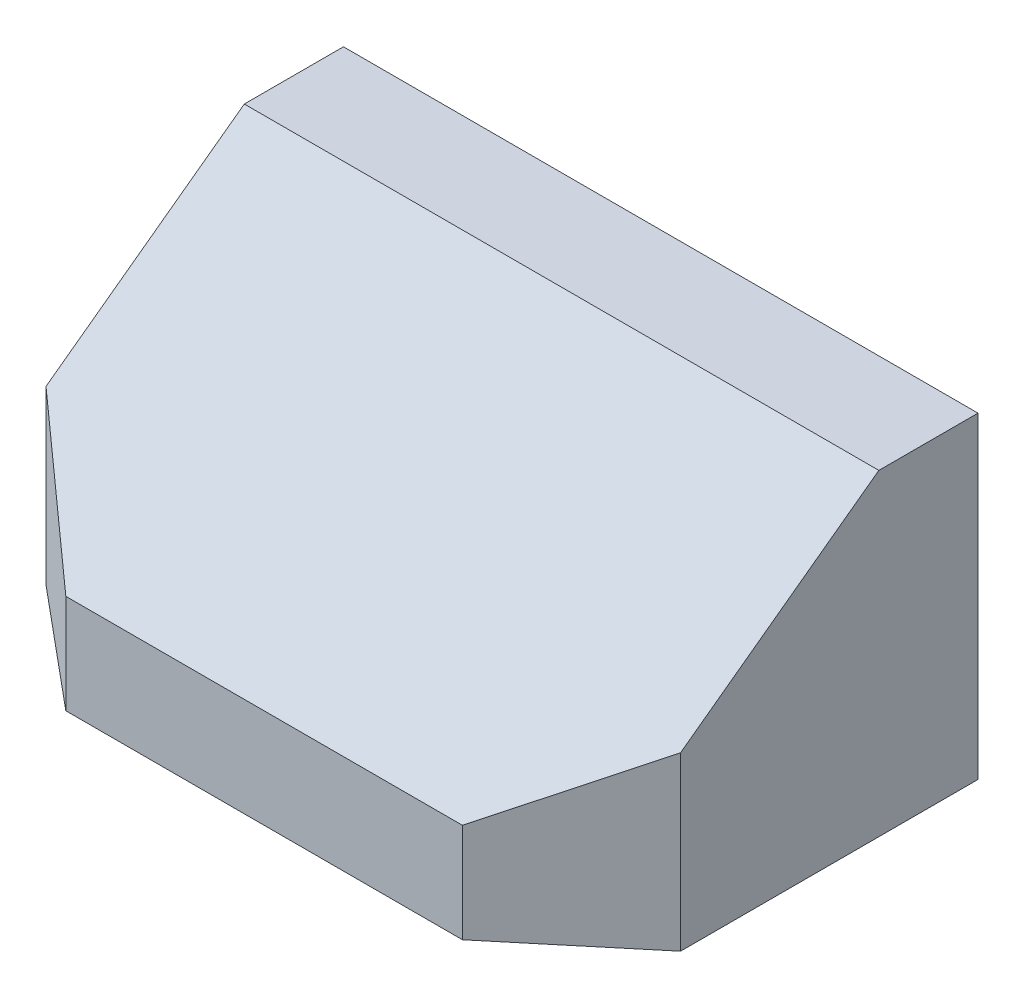
ISO-10303-21;
HEADER;
FILE_DESCRIPTION(('STEP AP214'),'2;1');
FILE_NAME('part.step','',(''),(''),'','','');
FILE_SCHEMA(('AUTOMOTIVE_DESIGN { 1 0 10303 214 1 1 1 1 }'));
ENDSEC;
DATA;
#1=APPLICATION_CONTEXT('core data for automotive mechanical design processes');
#2=APPLICATION_PROTOCOL_DEFINITION('international standard','automotive_design',2000,#1);
#3=PRODUCT_CONTEXT('',#1,'mechanical');
#4=PRODUCT('Part','Part','',(#3));
#5=PRODUCT_RELATED_PRODUCT_CATEGORY('part','',(#4));
#6=PRODUCT_DEFINITION_FORMATION('','',#4);
#7=PRODUCT_DEFINITION_CONTEXT('part definition',#1,'design');
#8=PRODUCT_DEFINITION('design','',#6,#7);
#9=PRODUCT_DEFINITION_SHAPE('','',#8);
#10=(LENGTH_UNIT() NAMED_UNIT(*) SI_UNIT(.MILLI.,.METRE.));
#11=(NAMED_UNIT(*) PLANE_ANGLE_UNIT() SI_UNIT($,.RADIAN.));
#12=(NAMED_UNIT(*) SI_UNIT($,.STERADIAN.) SOLID_ANGLE_UNIT());
#13=UNCERTAINTY_MEASURE_WITH_UNIT(LENGTH_MEASURE(1.E-05),#10,'distance_accuracy_value','');
#14=(GEOMETRIC_REPRESENTATION_CONTEXT(3) GLOBAL_UNCERTAINTY_ASSIGNED_CONTEXT((#13)) GLOBAL_UNIT_ASSIGNED_CONTEXT((#10,
#11,#12)) REPRESENTATION_CONTEXT('',''));
#15=CARTESIAN_POINT('',(0.,0.,0.));
#16=DIRECTION('',(0.,0.,1.));
#17=DIRECTION('',(1.,0.,0.));
#18=AXIS2_PLACEMENT_3D('',#15,#16,#17);
#19=CARTESIAN_POINT('',(-101.6,15.875,0.));
#20=DIRECTION('',(0.,0.,1.));
#21=DIRECTION('',(0.,-1.,0.));
#22=AXIS2_PLACEMENT_3D('',#19,#20,#21);
#23=PLANE('',#22);
#24=DIRECTION('',(0.,-1.,0.));
#25=VECTOR('',#24,1.);
#26=CARTESIAN_POINT('',(-82.55,101.6,0.));
#27=LINE('',#26,#25);
#28=CARTESIAN_POINT('',(-82.55,15.875,0.));
#29=VERTEX_POINT('',#28);
#30=CARTESIAN_POINT('',(-82.55,0.,0.));
#31=VERTEX_POINT('',#30);
#32=EDGE_CURVE('E102',#29,#31,#27,.T.);
#33=ORIENTED_EDGE('',*,*,#32,.T.);
#34=DIRECTION('',(1.,0.,0.));
#35=VECTOR('',#34,1.);
#36=CARTESIAN_POINT('',(-101.6,0.,0.));
#37=LINE('',#36,#35);
#38=CARTESIAN_POINT('',(-19.05,0.,0.));
#39=VERTEX_POINT('',#38);
#40=EDGE_CURVE('E101',#31,#39,#37,.T.);
#41=ORIENTED_EDGE('',*,*,#40,.T.);
#42=DIRECTION('',(0.,-1.,0.));
#43=VECTOR('',#42,1.);
#44=CARTESIAN_POINT('',(-19.05,101.6,0.));
#45=LINE('',#44,#43);
#46=CARTESIAN_POINT('',(-19.05,15.875,0.));
#47=VERTEX_POINT('',#46);
#48=EDGE_CURVE('E149',#47,#39,#45,.T.);
#49=ORIENTED_EDGE('',*,*,#48,.F.);
#50=DIRECTION('',(1.,0.,0.));
#51=VECTOR('',#50,1.);
#52=CARTESIAN_POINT('',(-101.6,15.875,0.));
#53=LINE('',#52,#51);
#54=EDGE_CURVE('E131',#29,#47,#53,.T.);
#55=ORIENTED_EDGE('',*,*,#54,.F.);
#56=EDGE_LOOP('',(#33,#41,#49,#55));
#57=FACE_BOUND('',#56,.T.);
#58=ADVANCED_FACE('F32',(#57),#23,.T.);
#59=CARTESIAN_POINT('',(-101.6,50.8,-47.625));
#60=DIRECTION('',(0.,0.806404995855706,0.591363663627517));
#61=DIRECTION('',(0.,-0.591363663627517,0.806404995855706));
#62=AXIS2_PLACEMENT_3D('',#59,#60,#61);
#63=PLANE('',#62);
#64=DIRECTION('',(-0.69540066835763,0.424967075107441,-0.579500556964692));
#65=VECTOR('',#64,1.);
#66=CARTESIAN_POINT('',(-121.27552238806,39.5405970149254,-32.2712686567164));
#67=LINE('',#66,#65);
#68=CARTESIAN_POINT('',(-101.6,27.5166666666667,-15.875));
#69=VERTEX_POINT('',#68);
#70=EDGE_CURVE('E46',#29,#69,#67,.T.);
#71=ORIENTED_EDGE('',*,*,#70,.F.);
#72=ORIENTED_EDGE('',*,*,#54,.T.);
#73=DIRECTION('',(-0.69540066835763,-0.42496707510744,0.579500556964692));
#74=VECTOR('',#73,1.);
#75=CARTESIAN_POINT('',(-29.4564179104478,9.51552238805969,8.67201492537314));
#76=LINE('',#75,#74);
#77=CARTESIAN_POINT('',(0.,27.5166666666667,-15.875));
#78=VERTEX_POINT('',#77);
#79=EDGE_CURVE('E117',#78,#47,#76,.T.);
#80=ORIENTED_EDGE('',*,*,#79,.F.);
#81=DIRECTION('',(0.,-0.591363663627517,0.806404995855706));
#82=VECTOR('',#81,1.);
#83=CARTESIAN_POINT('',(0.,50.8,-47.625));
#84=LINE('',#83,#82);
#85=CARTESIAN_POINT('',(0.,50.8,-47.625));
#86=VERTEX_POINT('',#85);
#87=EDGE_CURVE('E109',#86,#78,#84,.T.);
#88=ORIENTED_EDGE('',*,*,#87,.F.);
#89=DIRECTION('',(1.,0.,0.));
#90=VECTOR('',#89,1.);
#91=CARTESIAN_POINT('',(-101.6,50.8,-47.625));
#92=LINE('',#91,#90);
#93=CARTESIAN_POINT('',(-101.6,50.8,-47.625));
#94=VERTEX_POINT('',#93);
#95=EDGE_CURVE('E133',#94,#86,#92,.T.);
#96=ORIENTED_EDGE('',*,*,#95,.F.);
#97=DIRECTION('',(0.,-0.591363663627517,0.806404995855706));
#98=VECTOR('',#97,1.);
#99=CARTESIAN_POINT('',(-101.6,50.8,-47.625));
#100=LINE('',#99,#98);
#101=EDGE_CURVE('E122',#94,#69,#100,.T.);
#102=ORIENTED_EDGE('',*,*,#101,.T.);
#103=EDGE_LOOP('',(#71,#72,#80,#88,#96,#102));
#104=FACE_BOUND('',#103,.T.);
#105=ADVANCED_FACE('F147',(#104),#63,.T.);
#106=CARTESIAN_POINT('',(-101.6,50.8,-63.5));
#107=DIRECTION('',(0.,1.,0.));
#108=DIRECTION('',(0.,0.,1.));
#109=AXIS2_PLACEMENT_3D('',#106,#107,#108);
#110=PLANE('',#109);
#111=DIRECTION('',(0.,0.,1.));
#112=VECTOR('',#111,1.);
#113=CARTESIAN_POINT('',(0.,50.8,-63.5));
#114=LINE('',#113,#112);
#115=CARTESIAN_POINT('',(0.,50.8,-63.5));
#116=VERTEX_POINT('',#115);
#117=EDGE_CURVE('E114',#116,#86,#114,.T.);
#118=ORIENTED_EDGE('',*,*,#117,.F.);
#119=DIRECTION('',(1.,0.,0.));
#120=VECTOR('',#119,1.);
#121=CARTESIAN_POINT('',(-101.6,50.8,-63.5));
#122=LINE('',#121,#120);
#123=CARTESIAN_POINT('',(-101.6,50.8,-63.5));
#124=VERTEX_POINT('',#123);
#125=EDGE_CURVE('E135',#124,#116,#122,.T.);
#126=ORIENTED_EDGE('',*,*,#125,.F.);
#127=DIRECTION('',(0.,0.,1.));
#128=VECTOR('',#127,1.);
#129=CARTESIAN_POINT('',(-101.6,50.8,-63.5));
#130=LINE('',#129,#128);
#131=EDGE_CURVE('E111',#124,#94,#130,.T.);
#132=ORIENTED_EDGE('',*,*,#131,.T.);
#133=ORIENTED_EDGE('',*,*,#95,.T.);
#134=EDGE_LOOP('',(#118,#126,#132,#133));
#135=FACE_BOUND('',#134,.T.);
#136=ADVANCED_FACE('F154',(#135),#110,.T.);
#137=CARTESIAN_POINT('',(-101.6,0.,-63.5));
#138=DIRECTION('',(0.,0.,-1.));
#139=DIRECTION('',(-1.,0.,0.));
#140=AXIS2_PLACEMENT_3D('',#137,#138,#139);
#141=PLANE('',#140);
#142=DIRECTION('',(0.,1.,0.));
#143=VECTOR('',#142,1.);
#144=CARTESIAN_POINT('',(0.,0.,-63.5));
#145=LINE('',#144,#143);
#146=CARTESIAN_POINT('',(0.,0.,-63.5));
#147=VERTEX_POINT('',#146);
#148=EDGE_CURVE('E126',#147,#116,#145,.T.);
#149=ORIENTED_EDGE('',*,*,#148,.F.);
#150=DIRECTION('',(1.,0.,0.));
#151=VECTOR('',#150,1.);
#152=CARTESIAN_POINT('',(-101.6,0.,-63.5));
#153=LINE('',#152,#151);
#154=CARTESIAN_POINT('',(-101.6,0.,-63.5));
#155=VERTEX_POINT('',#154);
#156=EDGE_CURVE('E137',#155,#147,#153,.T.);
#157=ORIENTED_EDGE('',*,*,#156,.F.);
#158=DIRECTION('',(0.,1.,0.));
#159=VECTOR('',#158,1.);
#160=CARTESIAN_POINT('',(-101.6,0.,-63.5));
#161=LINE('',#160,#159);
#162=EDGE_CURVE('E108',#155,#124,#161,.T.);
#163=ORIENTED_EDGE('',*,*,#162,.T.);
#164=ORIENTED_EDGE('',*,*,#125,.T.);
#165=EDGE_LOOP('',(#149,#157,#163,#164));
#166=FACE_BOUND('',#165,.T.);
#167=ADVANCED_FACE('F156',(#166),#141,.T.);
#168=CARTESIAN_POINT('',(-101.6,0.,0.));
#169=DIRECTION('',(0.,-1.,0.));
#170=DIRECTION('',(0.,0.,-1.));
#171=AXIS2_PLACEMENT_3D('',#168,#169,#170);
#172=PLANE('',#171);
#173=DIRECTION('',(0.768221279597376,0.,0.64018439966448));
#174=VECTOR('',#173,1.);
#175=CARTESIAN_POINT('',(-82.55,0.,0.));
#176=LINE('',#175,#174);
#177=CARTESIAN_POINT('',(-101.6,0.,-15.875));
#178=VERTEX_POINT('',#177);
#179=EDGE_CURVE('E89',#178,#31,#176,.T.);
#180=ORIENTED_EDGE('',*,*,#179,.F.);
#181=DIRECTION('',(0.,0.,-1.));
#182=VECTOR('',#181,1.);
#183=CARTESIAN_POINT('',(-101.6,0.,0.));
#184=LINE('',#183,#182);
#185=EDGE_CURVE('E99',#178,#155,#184,.T.);
#186=ORIENTED_EDGE('',*,*,#185,.T.);
#187=ORIENTED_EDGE('',*,*,#156,.T.);
#188=DIRECTION('',(0.,0.,-1.));
#189=VECTOR('',#188,1.);
#190=CARTESIAN_POINT('',(0.,0.,0.));
#191=LINE('',#190,#189);
#192=CARTESIAN_POINT('',(0.,0.,-15.875));
#193=VERTEX_POINT('',#192);
#194=EDGE_CURVE('E124',#193,#147,#191,.T.);
#195=ORIENTED_EDGE('',*,*,#194,.F.);
#196=DIRECTION('',(0.768221279597376,0.,-0.64018439966448));
#197=VECTOR('',#196,1.);
#198=CARTESIAN_POINT('',(-19.05,0.,0.));
#199=LINE('',#198,#197);
#200=EDGE_CURVE('E53',#39,#193,#199,.T.);
#201=ORIENTED_EDGE('',*,*,#200,.F.);
#202=ORIENTED_EDGE('',*,*,#40,.F.);
#203=EDGE_LOOP('',(#180,#186,#187,#195,#201,#202));
#204=FACE_BOUND('',#203,.T.);
#205=ADVANCED_FACE('F97',(#204),#172,.T.);
#206=CARTESIAN_POINT('',(-101.6,0.,0.));
#207=DIRECTION('',(1.,0.,0.));
#208=DIRECTION('',(0.,0.,-1.));
#209=AXIS2_PLACEMENT_3D('',#206,#207,#208);
#210=PLANE('',#209);
#211=ORIENTED_EDGE('',*,*,#185,.F.);
#212=DIRECTION('',(0.,1.,0.));
#213=VECTOR('',#212,1.);
#214=CARTESIAN_POINT('',(-101.6,0.,-15.875));
#215=LINE('',#214,#213);
#216=EDGE_CURVE('E11',#178,#69,#215,.T.);
#217=ORIENTED_EDGE('',*,*,#216,.T.);
#218=ORIENTED_EDGE('',*,*,#101,.F.);
#219=ORIENTED_EDGE('',*,*,#131,.F.);
#220=ORIENTED_EDGE('',*,*,#162,.F.);
#221=EDGE_LOOP('',(#211,#217,#218,#219,#220));
#222=FACE_BOUND('',#221,.T.);
#223=ADVANCED_FACE('F105',(#222),#210,.F.);
#224=CARTESIAN_POINT('',(0.,0.,0.));
#225=DIRECTION('',(1.,0.,0.));
#226=DIRECTION('',(0.,0.,-1.));
#227=AXIS2_PLACEMENT_3D('',#224,#225,#226);
#228=PLANE('',#227);
#229=DIRECTION('',(0.,1.,0.));
#230=VECTOR('',#229,1.);
#231=CARTESIAN_POINT('',(0.,0.,-15.875));
#232=LINE('',#231,#230);
#233=EDGE_CURVE('E39',#193,#78,#232,.T.);
#234=ORIENTED_EDGE('',*,*,#233,.F.);
#235=ORIENTED_EDGE('',*,*,#194,.T.);
#236=ORIENTED_EDGE('',*,*,#148,.T.);
#237=ORIENTED_EDGE('',*,*,#117,.T.);
#238=ORIENTED_EDGE('',*,*,#87,.T.);
#239=EDGE_LOOP('',(#234,#235,#236,#237,#238));
#240=FACE_BOUND('',#239,.T.);
#241=ADVANCED_FACE('F150',(#240),#228,.T.);
#242=CARTESIAN_POINT('',(-19.05,101.6,0.));
#243=DIRECTION('',(-0.64018439966448,0.,-0.768221279597376));
#244=DIRECTION('',(-0.768221279597376,0.,0.64018439966448));
#245=AXIS2_PLACEMENT_3D('',#242,#243,#244);
#246=PLANE('',#245);
#247=ORIENTED_EDGE('',*,*,#79,.T.);
#248=ORIENTED_EDGE('',*,*,#48,.T.);
#249=ORIENTED_EDGE('',*,*,#200,.T.);
#250=ORIENTED_EDGE('',*,*,#233,.T.);
#251=EDGE_LOOP('',(#247,#248,#249,#250));
#252=FACE_BOUND('',#251,.T.);
#253=ADVANCED_FACE('F141',(#252),#246,.F.);
#254=CARTESIAN_POINT('',(-82.55,101.6,0.));
#255=DIRECTION('',(0.64018439966448,0.,-0.768221279597376));
#256=DIRECTION('',(-0.768221279597376,0.,-0.64018439966448));
#257=AXIS2_PLACEMENT_3D('',#254,#255,#256);
#258=PLANE('',#257);
#259=ORIENTED_EDGE('',*,*,#70,.T.);
#260=ORIENTED_EDGE('',*,*,#216,.F.);
#261=ORIENTED_EDGE('',*,*,#179,.T.);
#262=ORIENTED_EDGE('',*,*,#32,.F.);
#263=EDGE_LOOP('',(#259,#260,#261,#262));
#264=FACE_BOUND('',#263,.T.);
#265=ADVANCED_FACE('F88',(#264),#258,.F.);
#266=CLOSED_SHELL('',(#58,#105,#136,#167,#205,#223,#241,#253,#265));
#267=MANIFOLD_SOLID_BREP('B2',#266);
#268=ADVANCED_BREP_SHAPE_REPRESENTATION('',(#18,#267),#14);
#269=SHAPE_DEFINITION_REPRESENTATION(#9,#268);
ENDSEC;
END-ISO-10303-21;
